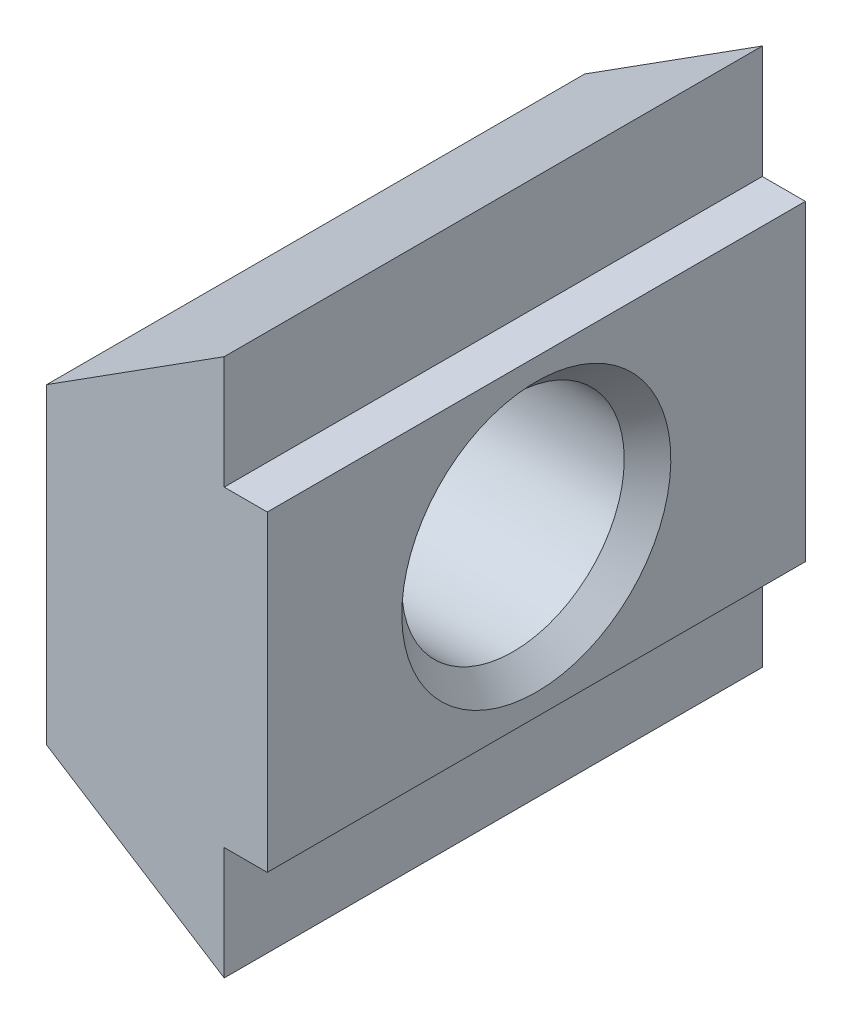
ISO-10303-21;
HEADER;
FILE_DESCRIPTION(('STEP AP214'),'2;1');
FILE_NAME('part.step','',(''),(''),'','','');
FILE_SCHEMA(('AUTOMOTIVE_DESIGN { 1 0 10303 214 1 1 1 1 }'));
ENDSEC;
DATA;
#1=APPLICATION_CONTEXT('core data for automotive mechanical design processes');
#2=APPLICATION_PROTOCOL_DEFINITION('international standard','automotive_design',2000,#1);
#3=PRODUCT_CONTEXT('',#1,'mechanical');
#4=PRODUCT('Part','Part','',(#3));
#5=PRODUCT_RELATED_PRODUCT_CATEGORY('part','',(#4));
#6=PRODUCT_DEFINITION_FORMATION('','',#4);
#7=PRODUCT_DEFINITION_CONTEXT('part definition',#1,'design');
#8=PRODUCT_DEFINITION('design','',#6,#7);
#9=PRODUCT_DEFINITION_SHAPE('','',#8);
#10=(LENGTH_UNIT() NAMED_UNIT(*) SI_UNIT(.MILLI.,.METRE.));
#11=(NAMED_UNIT(*) PLANE_ANGLE_UNIT() SI_UNIT($,.RADIAN.));
#12=(NAMED_UNIT(*) SI_UNIT($,.STERADIAN.) SOLID_ANGLE_UNIT());
#13=UNCERTAINTY_MEASURE_WITH_UNIT(LENGTH_MEASURE(1.E-05),#10,'distance_accuracy_value','');
#14=(GEOMETRIC_REPRESENTATION_CONTEXT(3) GLOBAL_UNCERTAINTY_ASSIGNED_CONTEXT((#13)) GLOBAL_UNIT_ASSIGNED_CONTEXT((#10,
#11,#12)) REPRESENTATION_CONTEXT('',''));
#15=CARTESIAN_POINT('',(0.,0.,0.));
#16=DIRECTION('',(0.,0.,1.));
#17=DIRECTION('',(1.,0.,0.));
#18=AXIS2_PLACEMENT_3D('',#15,#16,#17);
#19=CARTESIAN_POINT('',(-0.800000000000248,-4.99999999999967,-4.99999999999867));
#20=DIRECTION('',(1.,0.,0.));
#21=DIRECTION('',(0.,1.00000000000001,0.));
#22=AXIS2_PLACEMENT_3D('',#19,#20,#21);
#23=PLANE('',#22);
#24=DIRECTION('',(0.,0.,1.00000000000001));
#25=VECTOR('',#24,1.);
#26=CARTESIAN_POINT('',(-0.799999999998583,2.90000000000012,4.99999999999978));
#27=LINE('',#26,#25);
#28=CARTESIAN_POINT('',(-0.800000000001359,2.90000000000024,-5.00000000000034));
#29=VERTEX_POINT('',#28);
#30=CARTESIAN_POINT('',(-0.799999999998583,2.90000000000012,4.99999999999978));
#31=VERTEX_POINT('',#30);
#32=EDGE_CURVE('E54',#29,#31,#27,.T.);
#33=ORIENTED_EDGE('',*,*,#32,.F.);
#34=DIRECTION('',(0.,1.00000000000001,0.));
#35=VECTOR('',#34,1.);
#36=CARTESIAN_POINT('',(-0.800000000000248,-4.99999999999967,-4.99999999999867));
#37=LINE('',#36,#35);
#38=CARTESIAN_POINT('',(-0.8000000000008,5.00000000000034,-4.99999999999767));
#39=VERTEX_POINT('',#38);
#40=EDGE_CURVE('E136',#29,#39,#37,.T.);
#41=ORIENTED_EDGE('',*,*,#40,.T.);
#42=DIRECTION('',(0.,0.,1.00000000000001));
#43=VECTOR('',#42,1.);
#44=CARTESIAN_POINT('',(-0.8000000000008,5.00000000000034,-4.99999999999767));
#45=LINE('',#44,#43);
#46=CARTESIAN_POINT('',(-0.799999999998802,5.00000000000023,5.00000000000245));
#47=VERTEX_POINT('',#46);
#48=EDGE_CURVE('E159',#39,#47,#45,.T.);
#49=ORIENTED_EDGE('',*,*,#48,.T.);
#50=DIRECTION('',(0.,1.00000000000001,0.));
#51=VECTOR('',#50,1.);
#52=CARTESIAN_POINT('',(-0.799999999998805,-4.99999999999978,5.00000000000145));
#53=LINE('',#52,#51);
#54=EDGE_CURVE('E59',#31,#47,#53,.T.);
#55=ORIENTED_EDGE('',*,*,#54,.F.);
#56=EDGE_LOOP('',(#33,#41,#49,#55));
#57=FACE_BOUND('',#56,.T.);
#58=ADVANCED_FACE('F38',(#57),#23,.T.);
#59=CARTESIAN_POINT('',(-4.10000000000022,-2.89999999999924,-4.99999999999778));
#60=DIRECTION('',(-0.536875492193157,-0.843661487732115,0.));
#61=DIRECTION('',(0.843661487732107,-0.536875492193162,0.));
#62=AXIS2_PLACEMENT_3D('',#59,#60,#61);
#63=PLANE('',#62);
#64=DIRECTION('',(0.843661487732107,-0.536875492193162,0.));
#65=VECTOR('',#64,1.);
#66=CARTESIAN_POINT('',(-4.09999999999755,-2.89999999999957,5.00000000000234));
#67=LINE('',#66,#65);
#68=CARTESIAN_POINT('',(-4.09999999999755,-2.89999999999957,5.00000000000234));
#69=VERTEX_POINT('',#68);
#70=CARTESIAN_POINT('',(-0.799999999998805,-4.99999999999978,5.00000000000145));
#71=VERTEX_POINT('',#70);
#72=EDGE_CURVE('E126',#69,#71,#67,.T.);
#73=ORIENTED_EDGE('',*,*,#72,.F.);
#74=DIRECTION('',(0.,0.,1.00000000000001));
#75=VECTOR('',#74,1.);
#76=CARTESIAN_POINT('',(-4.10000000000022,-2.89999999999924,-4.99999999999778));
#77=LINE('',#76,#75);
#78=CARTESIAN_POINT('',(-4.10000000000022,-2.89999999999924,-4.99999999999778));
#79=VERTEX_POINT('',#78);
#80=EDGE_CURVE('E154',#79,#69,#77,.T.);
#81=ORIENTED_EDGE('',*,*,#80,.F.);
#82=DIRECTION('',(0.843661487732107,-0.536875492193162,0.));
#83=VECTOR('',#82,1.);
#84=CARTESIAN_POINT('',(-4.10000000000022,-2.89999999999924,-4.99999999999778));
#85=LINE('',#84,#83);
#86=CARTESIAN_POINT('',(-0.800000000000248,-4.99999999999967,-4.99999999999867));
#87=VERTEX_POINT('',#86);
#88=EDGE_CURVE('E133',#79,#87,#85,.T.);
#89=ORIENTED_EDGE('',*,*,#88,.T.);
#90=DIRECTION('',(0.,0.,1.00000000000001));
#91=VECTOR('',#90,1.);
#92=CARTESIAN_POINT('',(-0.800000000000248,-4.99999999999967,-4.99999999999867));
#93=LINE('',#92,#91);
#94=EDGE_CURVE('E145',#87,#71,#93,.T.);
#95=ORIENTED_EDGE('',*,*,#94,.T.);
#96=EDGE_LOOP('',(#73,#81,#89,#95));
#97=FACE_BOUND('',#96,.T.);
#98=ADVANCED_FACE('F188',(#97),#63,.T.);
#99=CARTESIAN_POINT('',(-4.10000000000111,2.90000000000079,-5.00000000000356));
#100=DIRECTION('',(-1.,0.,0.));
#101=DIRECTION('',(0.,0.,1.00000000000001));
#102=AXIS2_PLACEMENT_3D('',#99,#100,#101);
#103=PLANE('',#102);
#104=CARTESIAN_POINT('',(-4.09999999999999,1.11022302462516E-13,-4.44089209850063E-13));
#105=DIRECTION('',(-1.,0.,0.));
#106=DIRECTION('',(0.,0.,1.00000000000001));
#107=AXIS2_PLACEMENT_3D('',#104,#105,#106);
#108=CIRCLE('',#107,2.49999999999999);
#109=CARTESIAN_POINT('',(-4.09999999999999,2.1795331558855E-13,2.49999999999949));
#110=VERTEX_POINT('',#109);
#111=EDGE_CURVE('E11',#110,#110,#108,.F.);
#112=ORIENTED_EDGE('',*,*,#111,.T.);
#113=EDGE_LOOP('',(#112));
#114=FACE_BOUND('',#113,.T.);
#115=DIRECTION('',(0.,-1.00000000000001,0.));
#116=VECTOR('',#115,1.);
#117=CARTESIAN_POINT('',(-4.09999999999855,2.90000000000035,4.99999999999667));
#118=LINE('',#117,#116);
#119=CARTESIAN_POINT('',(-4.09999999999855,2.90000000000035,4.99999999999667));
#120=VERTEX_POINT('',#119);
#121=EDGE_CURVE('E137',#120,#69,#118,.T.);
#122=ORIENTED_EDGE('',*,*,#121,.F.);
#123=DIRECTION('',(0.,0.,1.00000000000001));
#124=VECTOR('',#123,1.);
#125=CARTESIAN_POINT('',(-4.10000000000111,2.90000000000079,-5.00000000000356));
#126=LINE('',#125,#124);
#127=CARTESIAN_POINT('',(-4.10000000000111,2.90000000000079,-5.00000000000356));
#128=VERTEX_POINT('',#127);
#129=EDGE_CURVE('E157',#128,#120,#126,.T.);
#130=ORIENTED_EDGE('',*,*,#129,.F.);
#131=DIRECTION('',(0.,-1.00000000000001,0.));
#132=VECTOR('',#131,1.);
#133=CARTESIAN_POINT('',(-4.10000000000111,2.90000000000079,-5.00000000000356));
#134=LINE('',#133,#132);
#135=EDGE_CURVE('E143',#128,#79,#134,.T.);
#136=ORIENTED_EDGE('',*,*,#135,.T.);
#137=ORIENTED_EDGE('',*,*,#80,.T.);
#138=EDGE_LOOP('',(#122,#130,#136,#137));
#139=FACE_BOUND('',#138,.T.);
#140=ADVANCED_FACE('F194',(#114,#139),#103,.T.);
#141=CARTESIAN_POINT('',(-0.8000000000008,5.00000000000034,-4.99999999999767));
#142=DIRECTION('',(-0.536875492193155,0.843661487732113,0.));
#143=DIRECTION('',(-0.843661487732109,-0.536875492193163,0.));
#144=AXIS2_PLACEMENT_3D('',#141,#142,#143);
#145=PLANE('',#144);
#146=DIRECTION('',(-0.843661487732109,-0.536875492193163,0.));
#147=VECTOR('',#146,1.);
#148=CARTESIAN_POINT('',(-0.799999999998802,5.00000000000023,5.00000000000245));
#149=LINE('',#148,#147);
#150=EDGE_CURVE('E149',#47,#120,#149,.T.);
#151=ORIENTED_EDGE('',*,*,#150,.F.);
#152=ORIENTED_EDGE('',*,*,#48,.F.);
#153=DIRECTION('',(-0.843661487732109,-0.536875492193163,0.));
#154=VECTOR('',#153,1.);
#155=CARTESIAN_POINT('',(-0.8000000000008,5.00000000000034,-4.99999999999767));
#156=LINE('',#155,#154);
#157=EDGE_CURVE('E140',#39,#128,#156,.T.);
#158=ORIENTED_EDGE('',*,*,#157,.T.);
#159=ORIENTED_EDGE('',*,*,#129,.T.);
#160=EDGE_LOOP('',(#151,#152,#158,#159));
#161=FACE_BOUND('',#160,.T.);
#162=ADVANCED_FACE('F200',(#161),#145,.T.);
#163=DIRECTION('',(0.,0.,-1.00000000000001));
#164=VECTOR('',#163,1.);
#165=CARTESIAN_POINT('',(-0.800000000000242,-2.89999999999979,-4.99999999999534));
#166=LINE('',#165,#164);
#167=CARTESIAN_POINT('',(-0.79999999999758,-2.8999999999999,5.00000000000478));
#168=VERTEX_POINT('',#167);
#169=CARTESIAN_POINT('',(-0.800000000000242,-2.89999999999979,-4.99999999999534));
#170=VERTEX_POINT('',#169);
#171=EDGE_CURVE('E123',#168,#170,#166,.T.);
#172=ORIENTED_EDGE('',*,*,#171,.F.);
#173=EDGE_CURVE('E147',#71,#168,#53,.T.);
#174=ORIENTED_EDGE('',*,*,#173,.F.);
#175=ORIENTED_EDGE('',*,*,#94,.F.);
#176=EDGE_CURVE('E138',#87,#170,#37,.T.);
#177=ORIENTED_EDGE('',*,*,#176,.T.);
#178=EDGE_LOOP('',(#172,#174,#175,#177));
#179=FACE_BOUND('',#178,.T.);
#180=ADVANCED_FACE('F190',(#179),#23,.T.);
#181=CARTESIAN_POINT('',(-3.36536354339501E-13,0.,-5.));
#182=DIRECTION('',(0.,0.,-1.00000000000001));
#183=DIRECTION('',(-1.,0.,0.));
#184=AXIS2_PLACEMENT_3D('',#181,#182,#183);
#185=PLANE('',#184);
#186=ORIENTED_EDGE('',*,*,#88,.F.);
#187=ORIENTED_EDGE('',*,*,#135,.F.);
#188=ORIENTED_EDGE('',*,*,#157,.F.);
#189=ORIENTED_EDGE('',*,*,#40,.F.);
#190=DIRECTION('',(-1.,0.,0.));
#191=VECTOR('',#190,1.);
#192=CARTESIAN_POINT('',(-1.33573707650214E-12,2.90000000000012,-4.99999999999978));
#193=LINE('',#192,#191);
#194=CARTESIAN_POINT('',(-1.33573707650214E-12,2.90000000000012,-4.99999999999978));
#195=VERTEX_POINT('',#194);
#196=EDGE_CURVE('E217',#195,#29,#193,.T.);
#197=ORIENTED_EDGE('',*,*,#196,.F.);
#198=DIRECTION('',(0.,1.00000000000001,0.));
#199=VECTOR('',#198,1.);
#200=CARTESIAN_POINT('',(-1.33573707650214E-12,2.90000000000012,-4.99999999999978));
#201=LINE('',#200,#199);
#202=CARTESIAN_POINT('',(-2.18575157973078E-13,-2.8999999999999,-5.00000000000134));
#203=VERTEX_POINT('',#202);
#204=EDGE_CURVE('E119',#203,#195,#201,.T.);
#205=ORIENTED_EDGE('',*,*,#204,.F.);
#206=DIRECTION('',(-1.,0.,0.));
#207=VECTOR('',#206,1.);
#208=CARTESIAN_POINT('',(-2.18575157973078E-13,-2.8999999999999,-5.00000000000134));
#209=LINE('',#208,#207);
#210=EDGE_CURVE('E129',#203,#170,#209,.T.);
#211=ORIENTED_EDGE('',*,*,#210,.T.);
#212=ORIENTED_EDGE('',*,*,#176,.F.);
#213=EDGE_LOOP('',(#186,#187,#188,#189,#197,#205,#211,#212));
#214=FACE_BOUND('',#213,.T.);
#215=ADVANCED_FACE('F199',(#214),#185,.T.);
#216=CARTESIAN_POINT('',(-1.66186508998578E-12,4.44089209850063E-13,5.00000000000012));
#217=DIRECTION('',(0.,0.,-1.00000000000001));
#218=DIRECTION('',(-1.,0.,0.));
#219=AXIS2_PLACEMENT_3D('',#216,#217,#218);
#220=PLANE('',#219);
#221=ORIENTED_EDGE('',*,*,#72,.T.);
#222=ORIENTED_EDGE('',*,*,#173,.T.);
#223=DIRECTION('',(-1.,0.,0.));
#224=VECTOR('',#223,1.);
#225=CARTESIAN_POINT('',(2.44249065417534E-12,-2.89999999999979,4.99999999999878));
#226=LINE('',#225,#224);
#227=CARTESIAN_POINT('',(2.44249065417534E-12,-2.89999999999979,4.99999999999878));
#228=VERTEX_POINT('',#227);
#229=EDGE_CURVE('E110',#228,#168,#226,.T.);
#230=ORIENTED_EDGE('',*,*,#229,.F.);
#231=DIRECTION('',(0.,-1.00000000000001,0.));
#232=VECTOR('',#231,1.);
#233=CARTESIAN_POINT('',(2.44249065417534E-12,-2.89999999999979,4.99999999999878));
#234=LINE('',#233,#232);
#235=CARTESIAN_POINT('',(1.43982048506075E-12,2.90000000000035,5.00000000000034));
#236=VERTEX_POINT('',#235);
#237=EDGE_CURVE('E102',#236,#228,#234,.T.);
#238=ORIENTED_EDGE('',*,*,#237,.F.);
#239=DIRECTION('',(-1.,0.,0.));
#240=VECTOR('',#239,1.);
#241=CARTESIAN_POINT('',(1.43982048506075E-12,2.90000000000035,5.00000000000034));
#242=LINE('',#241,#240);
#243=EDGE_CURVE('E107',#236,#31,#242,.T.);
#244=ORIENTED_EDGE('',*,*,#243,.T.);
#245=ORIENTED_EDGE('',*,*,#54,.T.);
#246=ORIENTED_EDGE('',*,*,#150,.T.);
#247=ORIENTED_EDGE('',*,*,#121,.T.);
#248=EDGE_LOOP('',(#221,#222,#230,#238,#244,#245,#246,#247));
#249=FACE_BOUND('',#248,.T.);
#250=ADVANCED_FACE('F105',(#249),#220,.F.);
#251=CARTESIAN_POINT('',(1.43982048506075E-12,2.90000000000035,5.00000000000034));
#252=DIRECTION('',(0.,-1.00000000000001,0.));
#253=DIRECTION('',(1.,0.,0.));
#254=AXIS2_PLACEMENT_3D('',#251,#252,#253);
#255=PLANE('',#254);
#256=ORIENTED_EDGE('',*,*,#32,.T.);
#257=ORIENTED_EDGE('',*,*,#243,.F.);
#258=DIRECTION('',(0.,0.,1.00000000000001));
#259=VECTOR('',#258,1.);
#260=CARTESIAN_POINT('',(1.43982048506075E-12,2.90000000000035,5.00000000000034));
#261=LINE('',#260,#259);
#262=EDGE_CURVE('E114',#195,#236,#261,.T.);
#263=ORIENTED_EDGE('',*,*,#262,.F.);
#264=ORIENTED_EDGE('',*,*,#196,.T.);
#265=EDGE_LOOP('',(#256,#257,#263,#264));
#266=FACE_BOUND('',#265,.T.);
#267=ADVANCED_FACE('F125',(#266),#255,.F.);
#268=CARTESIAN_POINT('',(-2.18575157973078E-13,-2.8999999999999,-5.00000000000134));
#269=DIRECTION('',(0.,1.00000000000001,0.));
#270=DIRECTION('',(-1.,0.,0.));
#271=AXIS2_PLACEMENT_3D('',#268,#269,#270);
#272=PLANE('',#271);
#273=ORIENTED_EDGE('',*,*,#171,.T.);
#274=ORIENTED_EDGE('',*,*,#210,.F.);
#275=DIRECTION('',(0.,0.,-1.00000000000001));
#276=VECTOR('',#275,1.);
#277=CARTESIAN_POINT('',(-2.18575157973078E-13,-2.8999999999999,-5.00000000000134));
#278=LINE('',#277,#276);
#279=EDGE_CURVE('E113',#228,#203,#278,.T.);
#280=ORIENTED_EDGE('',*,*,#279,.F.);
#281=ORIENTED_EDGE('',*,*,#229,.T.);
#282=EDGE_LOOP('',(#273,#274,#280,#281));
#283=FACE_BOUND('',#282,.T.);
#284=ADVANCED_FACE('F178',(#283),#272,.F.);
#285=CARTESIAN_POINT('',(0.,0.,0.));
#286=DIRECTION('',(-1.,0.,0.));
#287=DIRECTION('',(0.,-1.00000000000001,0.));
#288=AXIS2_PLACEMENT_3D('',#285,#286,#287);
#289=PLANE('',#288);
#290=CARTESIAN_POINT('',(0.,0.,0.));
#291=DIRECTION('',(-1.,0.,0.));
#292=DIRECTION('',(0.,-1.00000000000001,0.));
#293=AXIS2_PLACEMENT_3D('',#290,#291,#292);
#294=CIRCLE('',#293,2.49999999999999);
#295=CARTESIAN_POINT('',(0.,-2.50000000000001,0.));
#296=VERTEX_POINT('',#295);
#297=EDGE_CURVE('E156',#296,#296,#294,.T.);
#298=ORIENTED_EDGE('',*,*,#297,.T.);
#299=EDGE_LOOP('',(#298));
#300=FACE_BOUND('',#299,.T.);
#301=ORIENTED_EDGE('',*,*,#262,.T.);
#302=ORIENTED_EDGE('',*,*,#237,.T.);
#303=ORIENTED_EDGE('',*,*,#279,.T.);
#304=ORIENTED_EDGE('',*,*,#204,.T.);
#305=EDGE_LOOP('',(#301,#302,#303,#304));
#306=FACE_BOUND('',#305,.T.);
#307=ADVANCED_FACE('F117',(#300,#306),#289,.F.);
#308=CARTESIAN_POINT('',(-4.09999999999999,1.11022302462516E-13,-4.44089209850063E-13));
#309=DIRECTION('',(-1.,0.,0.));
#310=DIRECTION('',(0.,0.,1.00000000000001));
#311=AXIS2_PLACEMENT_3D('',#308,#309,#310);
#312=CYLINDRICAL_SURFACE('',#311,2.06699999999999);
#313=CARTESIAN_POINT('',(-0.433000000000017,0.,1.77635683940025E-12));
#314=DIRECTION('',(-1.,0.,0.));
#315=DIRECTION('',(0.,0.,1.00000000000001));
#316=AXIS2_PLACEMENT_3D('',#313,#314,#315);
#317=CIRCLE('',#316,2.06699999999999);
#318=CARTESIAN_POINT('',(-0.433000000000016,1.10436032687644E-13,2.06699999999957));
#319=VERTEX_POINT('',#318);
#320=EDGE_CURVE('E47',#319,#319,#317,.F.);
#321=CARTESIAN_POINT('',(-3.66699999999998,2.22044604925031E-13,-5.53376788836601E-13));
#322=DIRECTION('',(-1.,0.,0.));
#323=DIRECTION('',(0.,0.,1.00000000000001));
#324=AXIS2_PLACEMENT_3D('',#321,#322,#323);
#325=CIRCLE('',#324,2.06699999999999);
#326=CARTESIAN_POINT('',(-3.66699999999998,1.08189181907618E-13,2.06699999999957));
#327=VERTEX_POINT('',#326);
#328=EDGE_CURVE('E164',#327,#327,#325,.T.);
#329=CARTESIAN_POINT('',(-0.433000000000016,1.10436032687644E-13,2.06699999999957));
#330=CARTESIAN_POINT('',(-0.466687500000016,1.10412627992019E-13,2.06699999999957));
#331=CARTESIAN_POINT('',(-0.500375000000015,1.10389223296394E-13,2.06699999999957));
#332=CARTESIAN_POINT('',(-0.567750000000015,1.10342413905143E-13,2.06699999999957));
#333=CARTESIAN_POINT('',(-0.601437500000014,1.10319009209518E-13,2.06699999999957));
#334=CARTESIAN_POINT('',(-0.668812500000013,1.10272199818267E-13,2.06699999999957));
#335=CARTESIAN_POINT('',(-0.702500000000013,1.10248795122642E-13,2.06699999999957));
#336=CARTESIAN_POINT('',(-0.769875000000012,1.10201985731391E-13,2.06699999999957));
#337=CARTESIAN_POINT('',(-0.803562500000012,1.10178581035766E-13,2.06699999999957));
#338=CARTESIAN_POINT('',(-0.870937500000011,1.10131771644516E-13,2.06699999999957));
#339=CARTESIAN_POINT('',(-0.90462500000001,1.1010836694889E-13,2.06699999999957));
#340=CARTESIAN_POINT('',(-0.972000000000009,1.1006155755764E-13,2.06699999999957));
#341=CARTESIAN_POINT('',(-1.00568750000001,1.10038152862014E-13,2.06699999999957));
#342=CARTESIAN_POINT('',(-1.07306250000001,1.09991343470764E-13,2.06699999999957));
#343=CARTESIAN_POINT('',(-1.10675000000001,1.09967938775139E-13,2.06699999999957));
#344=CARTESIAN_POINT('',(-1.17412500000001,1.09921129383888E-13,2.06699999999957));
#345=CARTESIAN_POINT('',(-1.20781250000001,1.09897724688263E-13,2.06699999999957));
#346=CARTESIAN_POINT('',(-1.27518750000001,1.09850915297012E-13,2.06699999999957));
#347=CARTESIAN_POINT('',(-1.30887500000001,1.09827510601387E-13,2.06699999999957));
#348=CARTESIAN_POINT('',(-1.37625,1.09780701210136E-13,2.06699999999957));
#349=CARTESIAN_POINT('',(-1.4099375,1.09757296514511E-13,2.06699999999957));
#350=CARTESIAN_POINT('',(-1.4773125,1.09710487123261E-13,2.06699999999957));
#351=CARTESIAN_POINT('',(-1.511,1.09687082427635E-13,2.06699999999957));
#352=CARTESIAN_POINT('',(-1.578375,1.09640273036385E-13,2.06699999999957));
#353=CARTESIAN_POINT('',(-1.6120625,1.09616868340759E-13,2.06699999999957));
#354=CARTESIAN_POINT('',(-1.6794375,1.09570058949509E-13,2.06699999999957));
#355=CARTESIAN_POINT('',(-1.713125,1.09546654253884E-13,2.06699999999957));
#356=CARTESIAN_POINT('',(-1.7805,1.09499844862633E-13,2.06699999999957));
#357=CARTESIAN_POINT('',(-1.8141875,1.09476440167008E-13,2.06699999999957));
#358=CARTESIAN_POINT('',(-1.8815625,1.09429630775757E-13,2.06699999999957));
#359=CARTESIAN_POINT('',(-1.91525,1.09406226080132E-13,2.06699999999957));
#360=CARTESIAN_POINT('',(-1.982625,1.09359416688881E-13,2.06699999999957));
#361=CARTESIAN_POINT('',(-2.0163125,1.09336011993256E-13,2.06699999999957));
#362=CARTESIAN_POINT('',(-2.0836875,1.09289202602006E-13,2.06699999999957));
#363=CARTESIAN_POINT('',(-2.117375,1.0926579790638E-13,2.06699999999957));
#364=CARTESIAN_POINT('',(-2.18474999999999,1.0921898851513E-13,2.06699999999957));
#365=CARTESIAN_POINT('',(-2.21843749999999,1.09195583819505E-13,2.06699999999957));
#366=CARTESIAN_POINT('',(-2.28581249999999,1.09148774428254E-13,2.06699999999957));
#367=CARTESIAN_POINT('',(-2.31949999999999,1.09125369732629E-13,2.06699999999957));
#368=CARTESIAN_POINT('',(-2.38687499999999,1.09078560341378E-13,2.06699999999957));
#369=CARTESIAN_POINT('',(-2.42056249999999,1.09055155645753E-13,2.06699999999957));
#370=CARTESIAN_POINT('',(-2.48793749999999,1.09008346254502E-13,2.06699999999957));
#371=CARTESIAN_POINT('',(-2.52162499999999,1.08984941558877E-13,2.06699999999957));
#372=CARTESIAN_POINT('',(-2.58899999999999,1.08938132167627E-13,2.06699999999957));
#373=CARTESIAN_POINT('',(-2.62268749999999,1.08914727472001E-13,2.06699999999957));
#374=CARTESIAN_POINT('',(-2.69006249999999,1.08867918080751E-13,2.06699999999957));
#375=CARTESIAN_POINT('',(-2.72374999999999,1.08844513385125E-13,2.06699999999957));
#376=CARTESIAN_POINT('',(-2.79112499999999,1.08797703993875E-13,2.06699999999957));
#377=CARTESIAN_POINT('',(-2.82481249999999,1.0877429929825E-13,2.06699999999957));
#378=CARTESIAN_POINT('',(-2.89218749999999,1.08727489906999E-13,2.06699999999957));
#379=CARTESIAN_POINT('',(-2.92587499999999,1.08704085211374E-13,2.06699999999957));
#380=CARTESIAN_POINT('',(-2.99324999999998,1.08657275820123E-13,2.06699999999957));
#381=CARTESIAN_POINT('',(-3.02693749999998,1.08633871124498E-13,2.06699999999957));
#382=CARTESIAN_POINT('',(-3.09431249999998,1.08587061733247E-13,2.06699999999957));
#383=CARTESIAN_POINT('',(-3.12799999999998,1.08563657037622E-13,2.06699999999957));
#384=CARTESIAN_POINT('',(-3.19537499999998,1.08516847646372E-13,2.06699999999957));
#385=CARTESIAN_POINT('',(-3.22906249999998,1.08493442950746E-13,2.06699999999957));
#386=CARTESIAN_POINT('',(-3.29643749999998,1.08446633559496E-13,2.06699999999957));
#387=CARTESIAN_POINT('',(-3.33012499999998,1.08423228863871E-13,2.06699999999957));
#388=CARTESIAN_POINT('',(-3.39749999999998,1.0837641947262E-13,2.06699999999957));
#389=CARTESIAN_POINT('',(-3.43118749999998,1.08353014776995E-13,2.06699999999957));
#390=CARTESIAN_POINT('',(-3.49856249999998,1.08306205385744E-13,2.06699999999957));
#391=CARTESIAN_POINT('',(-3.53224999999998,1.08282800690119E-13,2.06699999999957));
#392=CARTESIAN_POINT('',(-3.59962499999998,1.08235991298868E-13,2.06699999999957));
#393=CARTESIAN_POINT('',(-3.63331249999998,1.08212586603243E-13,2.06699999999957));
#394=CARTESIAN_POINT('',(-3.66699999999998,1.08189181907618E-13,2.06699999999957));
#395=B_SPLINE_CURVE_WITH_KNOTS('',3,(#329,#330,#331,#332,#333,#334,#335,#336,#337,#338,#339,
#340,#341,#342,#343,#344,#345,#346,#347,#348,#349,#350,#351,#352,#353,#354,#355,#356,#357,#358,
#359,#360,#361,#362,#363,#364,#365,#366,#367,#368,#369,#370,#371,#372,#373,#374,#375,#376,#377,
#378,#379,#380,#381,#382,#383,#384,#385,#386,#387,#388,#389,#390,#391,#392,#393,#394),
.UNSPECIFIED.,.F.,.F.,(4,2,2,2,2,2,2,2,2,2,2,2,2,2,2,2,2,2,2,2,2,2,2,2,2,2,2,2,2,2,2,2,4),(0.,
0.101062499999999,0.202124999999997,0.303187499999996,0.404249999999995,0.505312499999994,
0.606374999999992,0.707437499999991,0.80849999999999,0.909562499999989,1.01062499999999,
1.11168749999999,1.21274999999998,1.31381249999998,1.41487499999998,1.51593749999998,
1.61699999999998,1.71806249999998,1.81912499999998,1.92018749999998,2.02124999999997,
2.12231249999997,2.22337499999997,2.32443749999997,2.42549999999997,2.52656249999997,
2.62762499999997,2.72868749999997,2.82974999999996,2.93081249999996,3.03187499999996,
3.13293749999996,3.23399999999996),.UNSPECIFIED.);
#396=EDGE_CURVE('BSEAM169',#319,#327,#395,.T.);
#397=ORIENTED_EDGE('',*,*,#320,.T.);
#398=ORIENTED_EDGE('',*,*,#328,.T.);
#399=ORIENTED_EDGE('',*,*,#396,.T.);
#400=ORIENTED_EDGE('',*,*,#396,.F.);
#401=EDGE_LOOP('',(#397,#399,#398,#400));
#402=FACE_BOUND('',#401,.T.);
#403=ADVANCED_FACE('F169',(#402),#312,.F.);
#404=CARTESIAN_POINT('',(0.,0.,0.));
#405=DIRECTION('',(1.,0.,0.));
#406=DIRECTION('',(0.,0.,-1.00000000000001));
#407=AXIS2_PLACEMENT_3D('',#404,#405,#406);
#408=CONICAL_SURFACE('',#407,2.49999999999999,0.785398163397445);
#409=ORIENTED_EDGE('',*,*,#320,.F.);
#410=EDGE_LOOP('',(#409));
#411=FACE_BOUND('',#410,.T.);
#412=ORIENTED_EDGE('',*,*,#297,.F.);
#413=EDGE_LOOP('',(#412));
#414=FACE_BOUND('',#413,.T.);
#415=ADVANCED_FACE('F172',(#411,#414),#408,.F.);
#416=CARTESIAN_POINT('',(-3.66699999999998,2.22044604925031E-13,-5.53376788836601E-13));
#417=DIRECTION('',(-1.,0.,0.));
#418=DIRECTION('',(0.,0.,1.00000000000001));
#419=AXIS2_PLACEMENT_3D('',#416,#417,#418);
#420=CONICAL_SURFACE('',#419,2.06699999999999,0.785398163397453);
#421=CARTESIAN_POINT('',(-4.09999999999999,2.1795331558855E-13,2.49999999999949));
#422=CARTESIAN_POINT('',(-4.09548958333333,2.17963287860543E-13,2.49548958333282));
#423=CARTESIAN_POINT('',(-4.09097916666666,2.17973260132535E-13,2.49097916666616));
#424=CARTESIAN_POINT('',(-4.08195833333332,2.1799320467652E-13,2.48195833333282));
#425=CARTESIAN_POINT('',(-4.07744791666666,2.18003176948513E-13,2.47744791666616));
#426=CARTESIAN_POINT('',(-4.06842708333332,2.18023121492498E-13,2.46842708333282));
#427=CARTESIAN_POINT('',(-4.06391666666666,2.1803309376449E-13,2.46391666666615));
#428=CARTESIAN_POINT('',(-4.05489583333332,2.18053038308475E-13,2.45489583333282));
#429=CARTESIAN_POINT('',(-4.05038541666666,2.18063010580468E-13,2.45038541666615));
#430=CARTESIAN_POINT('',(-4.04136458333332,2.18082955124453E-13,2.44136458333282));
#431=CARTESIAN_POINT('',(-4.03685416666666,2.18092927396446E-13,2.43685416666615));
#432=CARTESIAN_POINT('',(-4.02783333333332,2.18112871940431E-13,2.42783333333282));
#433=CARTESIAN_POINT('',(-4.02332291666666,2.18122844212423E-13,2.42332291666615));
#434=CARTESIAN_POINT('',(-4.01430208333332,2.18142788756408E-13,2.41430208333282));
#435=CARTESIAN_POINT('',(-4.00979166666666,2.18152761028401E-13,2.40979166666615));
#436=CARTESIAN_POINT('',(-4.00077083333332,2.18172705572386E-13,2.40077083333282));
#437=CARTESIAN_POINT('',(-3.99626041666665,2.18182677844378E-13,2.39626041666615));
#438=CARTESIAN_POINT('',(-3.98723958333332,2.18202622388363E-13,2.38723958333282));
#439=CARTESIAN_POINT('',(-3.98272916666665,2.18212594660356E-13,2.38272916666615));
#440=CARTESIAN_POINT('',(-3.97370833333332,2.18232539204341E-13,2.37370833333282));
#441=CARTESIAN_POINT('',(-3.96919791666665,2.18242511476333E-13,2.36919791666615));
#442=CARTESIAN_POINT('',(-3.96017708333332,2.18262456020319E-13,2.36017708333281));
#443=CARTESIAN_POINT('',(-3.95566666666665,2.18272428292311E-13,2.35566666666615));
#444=CARTESIAN_POINT('',(-3.94664583333332,2.18292372836296E-13,2.34664583333281));
#445=CARTESIAN_POINT('',(-3.94213541666665,2.18302345108289E-13,2.34213541666615));
#446=CARTESIAN_POINT('',(-3.93311458333332,2.18322289652274E-13,2.33311458333281));
#447=CARTESIAN_POINT('',(-3.92860416666665,2.18332261924266E-13,2.32860416666615));
#448=CARTESIAN_POINT('',(-3.91958333333332,2.18352206468251E-13,2.31958333333281));
#449=CARTESIAN_POINT('',(-3.91507291666665,2.18362178740244E-13,2.31507291666615));
#450=CARTESIAN_POINT('',(-3.90605208333332,2.18382123284229E-13,2.30605208333281));
#451=CARTESIAN_POINT('',(-3.90154166666665,2.18392095556221E-13,2.30154166666614));
#452=CARTESIAN_POINT('',(-3.89252083333332,2.18412040100207E-13,2.29252083333281));
#453=CARTESIAN_POINT('',(-3.88801041666665,2.18422012372199E-13,2.28801041666614));
#454=CARTESIAN_POINT('',(-3.87898958333332,2.18441956916184E-13,2.27898958333281));
#455=CARTESIAN_POINT('',(-3.87447916666665,2.18451929188177E-13,2.27447916666614));
#456=CARTESIAN_POINT('',(-3.86545833333332,2.18471873732162E-13,2.26545833333281));
#457=CARTESIAN_POINT('',(-3.86094791666665,2.18481846004154E-13,2.26094791666614));
#458=CARTESIAN_POINT('',(-3.85192708333332,2.18501790548139E-13,2.25192708333281));
#459=CARTESIAN_POINT('',(-3.84741666666665,2.18511762820132E-13,2.24741666666614));
#460=CARTESIAN_POINT('',(-3.83839583333332,2.18531707364117E-13,2.23839583333281));
#461=CARTESIAN_POINT('',(-3.83388541666665,2.18541679636109E-13,2.23388541666614));
#462=CARTESIAN_POINT('',(-3.82486458333331,2.18561624180094E-13,2.22486458333281));
#463=CARTESIAN_POINT('',(-3.82035416666665,2.18571596452087E-13,2.22035416666614));
#464=CARTESIAN_POINT('',(-3.81133333333331,2.18591540996072E-13,2.21133333333281));
#465=CARTESIAN_POINT('',(-3.80682291666665,2.18601513268065E-13,2.20682291666614));
#466=CARTESIAN_POINT('',(-3.79780208333331,2.1862145781205E-13,2.1978020833328));
#467=CARTESIAN_POINT('',(-3.79329166666665,2.18631430084042E-13,2.19329166666614));
#468=CARTESIAN_POINT('',(-3.78427083333331,2.18651374628027E-13,2.1842708333328));
#469=CARTESIAN_POINT('',(-3.77976041666665,2.1866134690002E-13,2.17976041666614));
#470=CARTESIAN_POINT('',(-3.77073958333331,2.18681291444005E-13,2.1707395833328));
#471=CARTESIAN_POINT('',(-3.76622916666665,2.18691263715997E-13,2.16622916666614));
#472=CARTESIAN_POINT('',(-3.75720833333331,2.18711208259982E-13,2.1572083333328));
#473=CARTESIAN_POINT('',(-3.75269791666665,2.18721180531975E-13,2.15269791666614));
#474=CARTESIAN_POINT('',(-3.74367708333331,2.1874112507596E-13,2.1436770833328));
#475=CARTESIAN_POINT('',(-3.73916666666664,2.18751097347953E-13,2.13916666666613));
#476=CARTESIAN_POINT('',(-3.73014583333331,2.18771041891938E-13,2.1301458333328));
#477=CARTESIAN_POINT('',(-3.72563541666664,2.1878101416393E-13,2.12563541666613));
#478=CARTESIAN_POINT('',(-3.71661458333331,2.18800958707915E-13,2.1166145833328));
#479=CARTESIAN_POINT('',(-3.71210416666664,2.18810930979908E-13,2.11210416666613));
#480=CARTESIAN_POINT('',(-3.70308333333331,2.18830875523893E-13,2.1030833333328));
#481=CARTESIAN_POINT('',(-3.69857291666664,2.18840847795885E-13,2.09857291666613));
#482=CARTESIAN_POINT('',(-3.68955208333331,2.1886079233987E-13,2.0895520833328));
#483=CARTESIAN_POINT('',(-3.68504166666664,2.18870764611863E-13,2.08504166666613));
#484=CARTESIAN_POINT('',(-3.67602083333331,2.18890709155848E-13,2.0760208333328));
#485=CARTESIAN_POINT('',(-3.67151041666664,2.1890068142784E-13,2.07151041666613));
#486=CARTESIAN_POINT('',(-3.66699999999998,2.18910653699833E-13,2.06699999999946));
#487=B_SPLINE_CURVE_WITH_KNOTS('',3,(#421,#422,#423,#424,#425,#426,#427,#428,#429,#430,#431,
#432,#433,#434,#435,#436,#437,#438,#439,#440,#441,#442,#443,#444,#445,#446,#447,#448,#449,#450,
#451,#452,#453,#454,#455,#456,#457,#458,#459,#460,#461,#462,#463,#464,#465,#466,#467,#468,#469,
#470,#471,#472,#473,#474,#475,#476,#477,#478,#479,#480,#481,#482,#483,#484,#485,#486),
.UNSPECIFIED.,.F.,.F.,(4,2,2,2,2,2,2,2,2,2,2,2,2,2,2,2,2,2,2,2,2,2,2,2,2,2,2,2,2,2,2,2,4),(0.,
0.019136077265862,0.038272154531724,0.0574082317975857,0.0765443090634477,0.0956803863293093,
0.114816463595171,0.133952540861033,0.153088618126895,0.172224695392757,0.191360772658619,
0.21049684992448,0.229632927190342,0.248769004456204,0.267905081722066,0.287041158987928,
0.30617723625379,0.325313313519652,0.344449390785514,0.363585468051376,0.382721545317238,
0.4018576225831,0.420993699848962,0.440129777114823,0.459265854380685,0.478401931646547,
0.497538008912409,0.516674086178271,0.535810163444133,0.554946240709995,0.574082317975857,
0.593218395241719,0.61235447250758),.UNSPECIFIED.);
#488=EDGE_CURVE('BSEAM41',#110,#327,#487,.T.);
#489=ORIENTED_EDGE('',*,*,#111,.F.);
#490=ORIENTED_EDGE('',*,*,#328,.F.);
#491=ORIENTED_EDGE('',*,*,#488,.T.);
#492=ORIENTED_EDGE('',*,*,#488,.F.);
#493=EDGE_LOOP('',(#489,#491,#490,#492));
#494=FACE_BOUND('',#493,.T.);
#495=ADVANCED_FACE('F41',(#494),#420,.F.);
#496=CLOSED_SHELL('',(#58,#98,#140,#162,#180,#215,#250,#267,#284,#307,#403,#415,#495));
#497=MANIFOLD_SOLID_BREP('B2',#496);
#498=ADVANCED_BREP_SHAPE_REPRESENTATION('',(#18,#497),#14);
#499=SHAPE_DEFINITION_REPRESENTATION(#9,#498);
ENDSEC;
END-ISO-10303-21;
